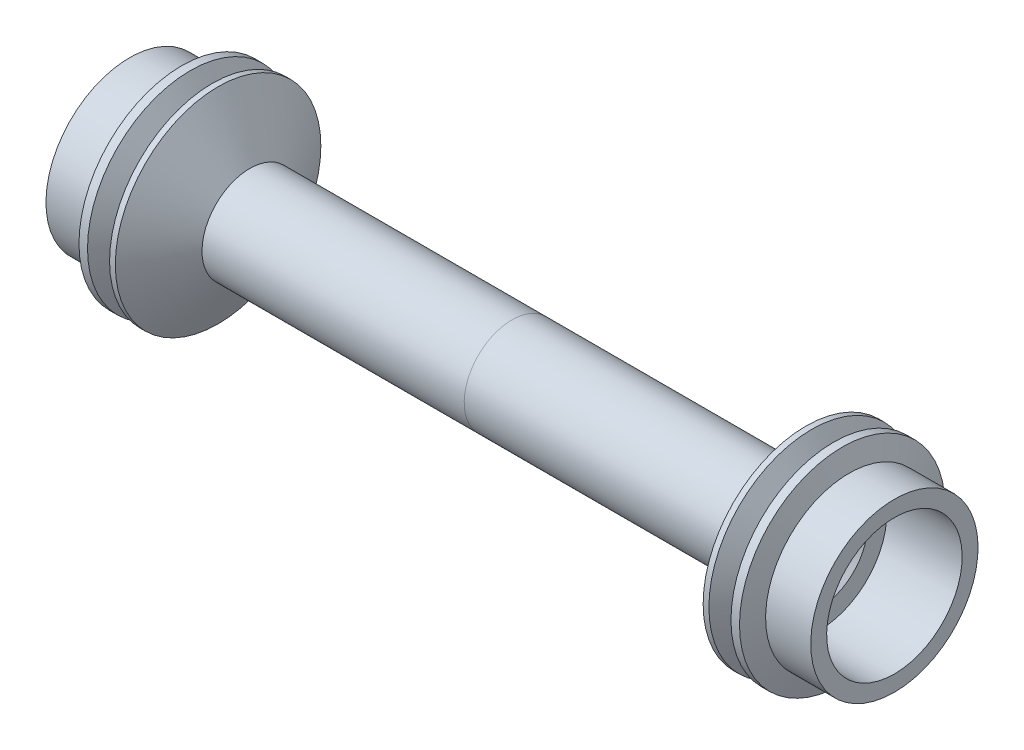
ISO-10303-21;
HEADER;
FILE_DESCRIPTION(('STEP AP214'),'2;1');
FILE_NAME('part.step','',(''),(''),'','','');
FILE_SCHEMA(('AUTOMOTIVE_DESIGN { 1 0 10303 214 1 1 1 1 }'));
ENDSEC;
DATA;
#1=APPLICATION_CONTEXT('core data for automotive mechanical design processes');
#2=APPLICATION_PROTOCOL_DEFINITION('international standard','automotive_design',2000,#1);
#3=PRODUCT_CONTEXT('',#1,'mechanical');
#4=PRODUCT('Part','Part','',(#3));
#5=PRODUCT_RELATED_PRODUCT_CATEGORY('part','',(#4));
#6=PRODUCT_DEFINITION_FORMATION('','',#4);
#7=PRODUCT_DEFINITION_CONTEXT('part definition',#1,'design');
#8=PRODUCT_DEFINITION('design','',#6,#7);
#9=PRODUCT_DEFINITION_SHAPE('','',#8);
#10=(LENGTH_UNIT() NAMED_UNIT(*) SI_UNIT(.MILLI.,.METRE.));
#11=(NAMED_UNIT(*) PLANE_ANGLE_UNIT() SI_UNIT($,.RADIAN.));
#12=(NAMED_UNIT(*) SI_UNIT($,.STERADIAN.) SOLID_ANGLE_UNIT());
#13=UNCERTAINTY_MEASURE_WITH_UNIT(LENGTH_MEASURE(1.E-05),#10,'distance_accuracy_value','');
#14=(GEOMETRIC_REPRESENTATION_CONTEXT(3) GLOBAL_UNCERTAINTY_ASSIGNED_CONTEXT((#13)) GLOBAL_UNIT_ASSIGNED_CONTEXT((#10,
#11,#12)) REPRESENTATION_CONTEXT('',''));
#15=CARTESIAN_POINT('',(0.,0.,0.));
#16=DIRECTION('',(0.,0.,1.));
#17=DIRECTION('',(1.,0.,0.));
#18=AXIS2_PLACEMENT_3D('',#15,#16,#17);
#19=CARTESIAN_POINT('',(20.4,0.,0.));
#20=DIRECTION('',(1.,0.,0.));
#21=DIRECTION('',(0.,-1.,0.));
#22=AXIS2_PLACEMENT_3D('',#19,#20,#21);
#23=CONICAL_SURFACE('',#22,3.23,0.785398163397443);
#24=CARTESIAN_POINT('',(19.892,0.,0.));
#25=DIRECTION('',(-1.,0.,0.));
#26=DIRECTION('',(0.,-1.,0.));
#27=AXIS2_PLACEMENT_3D('',#24,#25,#26);
#28=CIRCLE('',#27,2.722);
#29=CARTESIAN_POINT('',(19.892,-2.722,0.));
#30=VERTEX_POINT('',#29);
#31=EDGE_CURVE('E12',#30,#30,#28,.T.);
#32=ORIENTED_EDGE('',*,*,#31,.T.);
#33=EDGE_LOOP('',(#32));
#34=FACE_BOUND('',#33,.T.);
#35=CARTESIAN_POINT('',(20.4,0.,0.));
#36=DIRECTION('',(-1.,0.,0.));
#37=DIRECTION('',(0.,-1.,0.));
#38=AXIS2_PLACEMENT_3D('',#35,#36,#37);
#39=CIRCLE('',#38,3.23);
#40=CARTESIAN_POINT('',(20.4,-3.23,0.));
#41=VERTEX_POINT('',#40);
#42=EDGE_CURVE('E116',#41,#41,#39,.T.);
#43=ORIENTED_EDGE('',*,*,#42,.F.);
#44=EDGE_LOOP('',(#43));
#45=FACE_BOUND('',#44,.T.);
#46=ADVANCED_FACE('F59',(#34,#45),#23,.F.);
#47=CARTESIAN_POINT('',(19.892,0.,0.));
#48=DIRECTION('',(-1.,0.,0.));
#49=DIRECTION('',(0.,1.,0.));
#50=AXIS2_PLACEMENT_3D('',#47,#48,#49);
#51=PLANE('',#50);
#52=CARTESIAN_POINT('',(19.892,0.,0.));
#53=DIRECTION('',(-1.,0.,0.));
#54=DIRECTION('',(0.,-1.,0.));
#55=AXIS2_PLACEMENT_3D('',#52,#53,#54);
#56=CIRCLE('',#55,1.7145);
#57=CARTESIAN_POINT('',(19.892,-1.7145,0.));
#58=VERTEX_POINT('',#57);
#59=EDGE_CURVE('E66',#58,#58,#56,.T.);
#60=ORIENTED_EDGE('',*,*,#59,.T.);
#61=EDGE_LOOP('',(#60));
#62=FACE_BOUND('',#61,.T.);
#63=ORIENTED_EDGE('',*,*,#31,.F.);
#64=EDGE_LOOP('',(#63));
#65=FACE_BOUND('',#64,.T.);
#66=ADVANCED_FACE('F95',(#62,#65),#51,.F.);
#67=CARTESIAN_POINT('',(25.4,0.,0.));
#68=DIRECTION('',(1.,0.,0.));
#69=DIRECTION('',(0.,-1.,0.));
#70=AXIS2_PLACEMENT_3D('',#67,#68,#69);
#71=CYLINDRICAL_SURFACE('',#70,1.7145);
#72=CARTESIAN_POINT('',(15.575,0.,0.));
#73=DIRECTION('',(-1.,0.,0.));
#74=DIRECTION('',(0.,-1.,0.));
#75=AXIS2_PLACEMENT_3D('',#72,#73,#74);
#76=CIRCLE('',#75,1.7145);
#77=CARTESIAN_POINT('',(15.575,-1.7145,0.));
#78=VERTEX_POINT('',#77);
#79=EDGE_CURVE('E80',#78,#78,#76,.T.);
#80=ORIENTED_EDGE('',*,*,#79,.T.);
#81=EDGE_LOOP('',(#80));
#82=FACE_BOUND('',#81,.T.);
#83=ORIENTED_EDGE('',*,*,#59,.F.);
#84=EDGE_LOOP('',(#83));
#85=FACE_BOUND('',#84,.T.);
#86=ADVANCED_FACE('F98',(#82,#85),#71,.F.);
#87=CARTESIAN_POINT('',(15.575,0.,0.));
#88=DIRECTION('',(-1.,0.,0.));
#89=DIRECTION('',(0.,1.,0.));
#90=AXIS2_PLACEMENT_3D('',#87,#88,#89);
#91=PLANE('',#90);
#92=ORIENTED_EDGE('',*,*,#79,.F.);
#93=EDGE_LOOP('',(#92));
#94=FACE_BOUND('',#93,.T.);
#95=ADVANCED_FACE('F73',(#94),#91,.F.);
#96=CARTESIAN_POINT('',(12.5,0.,0.));
#97=DIRECTION('',(-1.,0.,0.));
#98=DIRECTION('',(0.,1.,0.));
#99=AXIS2_PLACEMENT_3D('',#96,#97,#98);
#100=CONICAL_SURFACE('',#99,1.6,0.78539816339745);
#101=CARTESIAN_POINT('',(14.1,0.,0.));
#102=VERTEX_POINT('',#101);
#103=VERTEX_LOOP('',#102);
#104=FACE_BOUND('',#103,.T.);
#105=CARTESIAN_POINT('',(12.5,0.,0.));
#106=DIRECTION('',(-1.,0.,0.));
#107=DIRECTION('',(0.,-1.,0.));
#108=AXIS2_PLACEMENT_3D('',#105,#106,#107);
#109=CIRCLE('',#108,1.6);
#110=CARTESIAN_POINT('',(12.5,-1.6,0.));
#111=VERTEX_POINT('',#110);
#112=EDGE_CURVE('E77',#111,#111,#109,.T.);
#113=ORIENTED_EDGE('',*,*,#112,.T.);
#114=EDGE_LOOP('',(#113));
#115=FACE_BOUND('',#114,.T.);
#116=ADVANCED_FACE('F69',(#104,#115),#100,.F.);
#117=CARTESIAN_POINT('',(25.4,0.,0.));
#118=DIRECTION('',(1.,0.,0.));
#119=DIRECTION('',(0.,-1.,0.));
#120=AXIS2_PLACEMENT_3D('',#117,#118,#119);
#121=CYLINDRICAL_SURFACE('',#120,1.6);
#122=ORIENTED_EDGE('',*,*,#112,.F.);
#123=EDGE_LOOP('',(#122));
#124=FACE_BOUND('',#123,.T.);
#125=CARTESIAN_POINT('',(0.,0.,0.));
#126=DIRECTION('',(-1.,0.,0.));
#127=DIRECTION('',(0.,-1.,0.));
#128=AXIS2_PLACEMENT_3D('',#125,#126,#127);
#129=CIRCLE('',#128,1.6);
#130=CARTESIAN_POINT('',(0.,-1.6,0.));
#131=VERTEX_POINT('',#130);
#132=EDGE_CURVE('E81',#131,#131,#129,.T.);
#133=ORIENTED_EDGE('',*,*,#132,.T.);
#134=EDGE_LOOP('',(#133));
#135=FACE_BOUND('',#134,.T.);
#136=ADVANCED_FACE('F72',(#124,#135),#121,.F.);
#137=CARTESIAN_POINT('',(0.,0.,0.));
#138=DIRECTION('',(1.,0.,0.));
#139=DIRECTION('',(0.,-1.,0.));
#140=AXIS2_PLACEMENT_3D('',#137,#138,#139);
#141=PLANE('',#140);
#142=CARTESIAN_POINT('',(0.,0.,0.));
#143=DIRECTION('',(-1.,0.,0.));
#144=DIRECTION('',(0.,-1.,0.));
#145=AXIS2_PLACEMENT_3D('',#142,#143,#144);
#146=CIRCLE('',#145,3.175);
#147=CARTESIAN_POINT('',(0.,-3.175,0.));
#148=VERTEX_POINT('',#147);
#149=EDGE_CURVE('E88',#148,#148,#146,.T.);
#150=ORIENTED_EDGE('',*,*,#149,.T.);
#151=EDGE_LOOP('',(#150));
#152=FACE_BOUND('',#151,.T.);
#153=ORIENTED_EDGE('',*,*,#132,.F.);
#154=EDGE_LOOP('',(#153));
#155=FACE_BOUND('',#154,.T.);
#156=ADVANCED_FACE('F164',(#152,#155),#141,.F.);
#157=CARTESIAN_POINT('',(25.4,0.,0.));
#158=DIRECTION('',(1.,0.,0.));
#159=DIRECTION('',(0.,-1.,0.));
#160=AXIS2_PLACEMENT_3D('',#157,#158,#159);
#161=CYLINDRICAL_SURFACE('',#160,3.175);
#162=ORIENTED_EDGE('',*,*,#149,.F.);
#163=EDGE_LOOP('',(#162));
#164=FACE_BOUND('',#163,.T.);
#165=CARTESIAN_POINT('',(17.4152149877506,0.,0.));
#166=DIRECTION('',(-1.,0.,0.));
#167=DIRECTION('',(0.,-1.,0.));
#168=AXIS2_PLACEMENT_3D('',#165,#166,#167);
#169=CIRCLE('',#168,3.175);
#170=CARTESIAN_POINT('',(17.4152149877506,-3.175,0.));
#171=VERTEX_POINT('',#170);
#172=EDGE_CURVE('E157',#171,#171,#169,.T.);
#173=ORIENTED_EDGE('',*,*,#172,.T.);
#174=EDGE_LOOP('',(#173));
#175=FACE_BOUND('',#174,.T.);
#176=ADVANCED_FACE('F167',(#164,#175),#161,.T.);
#177=CARTESIAN_POINT('',(19.5232651581292,0.,0.));
#178=DIRECTION('',(1.,0.,0.));
#179=DIRECTION('',(0.,-1.,0.));
#180=AXIS2_PLACEMENT_3D('',#177,#178,#179);
#181=CONICAL_SURFACE('',#180,6.82625,1.0471975511966);
#182=ORIENTED_EDGE('',*,*,#172,.F.);
#183=EDGE_LOOP('',(#182));
#184=FACE_BOUND('',#183,.T.);
#185=CARTESIAN_POINT('',(19.5232651581292,0.,0.));
#186=DIRECTION('',(-1.,0.,0.));
#187=DIRECTION('',(0.,-1.,0.));
#188=AXIS2_PLACEMENT_3D('',#185,#186,#187);
#189=CIRCLE('',#188,6.82625);
#190=CARTESIAN_POINT('',(19.5232651581292,-6.82625,0.));
#191=VERTEX_POINT('',#190);
#192=EDGE_CURVE('E153',#191,#191,#189,.T.);
#193=ORIENTED_EDGE('',*,*,#192,.T.);
#194=EDGE_LOOP('',(#193));
#195=FACE_BOUND('',#194,.T.);
#196=ADVANCED_FACE('F170',(#184,#195),#181,.T.);
#197=CARTESIAN_POINT('',(25.4,0.,0.));
#198=DIRECTION('',(1.,0.,0.));
#199=DIRECTION('',(0.,-1.,0.));
#200=AXIS2_PLACEMENT_3D('',#197,#198,#199);
#201=CYLINDRICAL_SURFACE('',#200,6.82625);
#202=ORIENTED_EDGE('',*,*,#192,.F.);
#203=EDGE_LOOP('',(#202));
#204=FACE_BOUND('',#203,.T.);
#205=CARTESIAN_POINT('',(19.9042651581292,0.,0.));
#206=DIRECTION('',(-1.,0.,0.));
#207=DIRECTION('',(0.,-1.,0.));
#208=AXIS2_PLACEMENT_3D('',#205,#206,#207);
#209=CIRCLE('',#208,6.82625);
#210=CARTESIAN_POINT('',(19.9042651581292,-6.82625,0.));
#211=VERTEX_POINT('',#210);
#212=EDGE_CURVE('E149',#211,#211,#209,.T.);
#213=ORIENTED_EDGE('',*,*,#212,.T.);
#214=EDGE_LOOP('',(#213));
#215=FACE_BOUND('',#214,.T.);
#216=ADVANCED_FACE('F176',(#204,#215),#201,.T.);
#217=CARTESIAN_POINT('',(20.6375,0.,0.));
#218=DIRECTION('',(-1.,0.,0.));
#219=DIRECTION('',(0.,1.,0.));
#220=AXIS2_PLACEMENT_3D('',#217,#218,#219);
#221=CONICAL_SURFACE('',#220,5.55625,1.0471975511966);
#222=ORIENTED_EDGE('',*,*,#212,.F.);
#223=EDGE_LOOP('',(#222));
#224=FACE_BOUND('',#223,.T.);
#225=CARTESIAN_POINT('',(20.6375,0.,0.));
#226=DIRECTION('',(-1.,0.,0.));
#227=DIRECTION('',(0.,-1.,0.));
#228=AXIS2_PLACEMENT_3D('',#225,#226,#227);
#229=CIRCLE('',#228,5.55625);
#230=CARTESIAN_POINT('',(20.6375,-5.55625,0.));
#231=VERTEX_POINT('',#230);
#232=EDGE_CURVE('E145',#231,#231,#229,.T.);
#233=ORIENTED_EDGE('',*,*,#232,.T.);
#234=EDGE_LOOP('',(#233));
#235=FACE_BOUND('',#234,.T.);
#236=ADVANCED_FACE('F182',(#224,#235),#221,.T.);
#237=CARTESIAN_POINT('',(21.3707348418708,0.,0.));
#238=DIRECTION('',(1.,0.,0.));
#239=DIRECTION('',(0.,-1.,0.));
#240=AXIS2_PLACEMENT_3D('',#237,#238,#239);
#241=CONICAL_SURFACE('',#240,6.82625,1.0471975511966);
#242=ORIENTED_EDGE('',*,*,#232,.F.);
#243=EDGE_LOOP('',(#242));
#244=FACE_BOUND('',#243,.T.);
#245=CARTESIAN_POINT('',(21.3707348418708,0.,0.));
#246=DIRECTION('',(-1.,0.,0.));
#247=DIRECTION('',(0.,-1.,0.));
#248=AXIS2_PLACEMENT_3D('',#245,#246,#247);
#249=CIRCLE('',#248,6.82625);
#250=CARTESIAN_POINT('',(21.3707348418708,-6.82625,0.));
#251=VERTEX_POINT('',#250);
#252=EDGE_CURVE('E141',#251,#251,#249,.T.);
#253=ORIENTED_EDGE('',*,*,#252,.T.);
#254=EDGE_LOOP('',(#253));
#255=FACE_BOUND('',#254,.T.);
#256=ADVANCED_FACE('F188',(#244,#255),#241,.T.);
#257=CARTESIAN_POINT('',(25.4,0.,0.));
#258=DIRECTION('',(1.,0.,0.));
#259=DIRECTION('',(0.,-1.,0.));
#260=AXIS2_PLACEMENT_3D('',#257,#258,#259);
#261=CYLINDRICAL_SURFACE('',#260,6.82625);
#262=ORIENTED_EDGE('',*,*,#252,.F.);
#263=EDGE_LOOP('',(#262));
#264=FACE_BOUND('',#263,.T.);
#265=CARTESIAN_POINT('',(21.9377578024819,0.,0.));
#266=DIRECTION('',(-1.,0.,0.));
#267=DIRECTION('',(0.,-1.,0.));
#268=AXIS2_PLACEMENT_3D('',#265,#266,#267);
#269=CIRCLE('',#268,6.82625);
#270=CARTESIAN_POINT('',(21.9377578024819,-6.82625,0.));
#271=VERTEX_POINT('',#270);
#272=EDGE_CURVE('E137',#271,#271,#269,.T.);
#273=ORIENTED_EDGE('',*,*,#272,.T.);
#274=EDGE_LOOP('',(#273));
#275=FACE_BOUND('',#274,.T.);
#276=ADVANCED_FACE('F194',(#264,#275),#261,.T.);
#277=CARTESIAN_POINT('',(22.4,0.,0.));
#278=DIRECTION('',(-1.,0.,0.));
#279=DIRECTION('',(0.,1.,0.));
#280=AXIS2_PLACEMENT_3D('',#277,#278,#279);
#281=CONICAL_SURFACE('',#280,5.55625,1.22173047639603);
#282=ORIENTED_EDGE('',*,*,#272,.F.);
#283=EDGE_LOOP('',(#282));
#284=FACE_BOUND('',#283,.T.);
#285=CARTESIAN_POINT('',(22.4,0.,0.));
#286=DIRECTION('',(-1.,0.,0.));
#287=DIRECTION('',(0.,-1.,0.));
#288=AXIS2_PLACEMENT_3D('',#285,#286,#287);
#289=CIRCLE('',#288,5.55625);
#290=CARTESIAN_POINT('',(22.4,-5.55625,0.));
#291=VERTEX_POINT('',#290);
#292=EDGE_CURVE('E133',#291,#291,#289,.T.);
#293=ORIENTED_EDGE('',*,*,#292,.T.);
#294=EDGE_LOOP('',(#293));
#295=FACE_BOUND('',#294,.T.);
#296=ADVANCED_FACE('F200',(#284,#295),#281,.T.);
#297=CARTESIAN_POINT('',(25.4,0.,0.));
#298=DIRECTION('',(1.,0.,0.));
#299=DIRECTION('',(0.,-1.,0.));
#300=AXIS2_PLACEMENT_3D('',#297,#298,#299);
#301=CYLINDRICAL_SURFACE('',#300,5.55625);
#302=ORIENTED_EDGE('',*,*,#292,.F.);
#303=EDGE_LOOP('',(#302));
#304=FACE_BOUND('',#303,.T.);
#305=CARTESIAN_POINT('',(25.4,0.,0.));
#306=DIRECTION('',(-1.,0.,0.));
#307=DIRECTION('',(0.,-1.,0.));
#308=AXIS2_PLACEMENT_3D('',#305,#306,#307);
#309=CIRCLE('',#308,5.55625);
#310=CARTESIAN_POINT('',(25.4,-5.55625,0.));
#311=VERTEX_POINT('',#310);
#312=EDGE_CURVE('E129',#311,#311,#309,.T.);
#313=ORIENTED_EDGE('',*,*,#312,.T.);
#314=EDGE_LOOP('',(#313));
#315=FACE_BOUND('',#314,.T.);
#316=ADVANCED_FACE('F206',(#304,#315),#301,.T.);
#317=CARTESIAN_POINT('',(25.4,0.,0.));
#318=DIRECTION('',(-1.,0.,0.));
#319=DIRECTION('',(0.,1.,0.));
#320=AXIS2_PLACEMENT_3D('',#317,#318,#319);
#321=PLANE('',#320);
#322=CARTESIAN_POINT('',(25.4,0.,0.));
#323=DIRECTION('',(-1.,0.,0.));
#324=DIRECTION('',(0.,-1.,0.));
#325=AXIS2_PLACEMENT_3D('',#322,#323,#324);
#326=CIRCLE('',#325,4.5);
#327=CARTESIAN_POINT('',(25.4,-4.5,0.));
#328=VERTEX_POINT('',#327);
#329=EDGE_CURVE('E123',#328,#328,#326,.T.);
#330=ORIENTED_EDGE('',*,*,#329,.T.);
#331=EDGE_LOOP('',(#330));
#332=FACE_BOUND('',#331,.T.);
#333=ORIENTED_EDGE('',*,*,#312,.F.);
#334=EDGE_LOOP('',(#333));
#335=FACE_BOUND('',#334,.T.);
#336=ADVANCED_FACE('F212',(#332,#335),#321,.F.);
#337=CARTESIAN_POINT('',(25.4,0.,0.));
#338=DIRECTION('',(1.,0.,0.));
#339=DIRECTION('',(0.,-1.,0.));
#340=AXIS2_PLACEMENT_3D('',#337,#338,#339);
#341=CYLINDRICAL_SURFACE('',#340,4.5);
#342=CARTESIAN_POINT('',(20.4,0.,0.));
#343=DIRECTION('',(-1.,0.,0.));
#344=DIRECTION('',(0.,-1.,0.));
#345=AXIS2_PLACEMENT_3D('',#342,#343,#344);
#346=CIRCLE('',#345,4.5);
#347=CARTESIAN_POINT('',(20.4,-4.5,0.));
#348=VERTEX_POINT('',#347);
#349=EDGE_CURVE('E119',#348,#348,#346,.T.);
#350=ORIENTED_EDGE('',*,*,#349,.T.);
#351=EDGE_LOOP('',(#350));
#352=FACE_BOUND('',#351,.T.);
#353=ORIENTED_EDGE('',*,*,#329,.F.);
#354=EDGE_LOOP('',(#353));
#355=FACE_BOUND('',#354,.T.);
#356=ADVANCED_FACE('F217',(#352,#355),#341,.F.);
#357=CARTESIAN_POINT('',(20.4,0.,0.));
#358=DIRECTION('',(-1.,0.,0.));
#359=DIRECTION('',(0.,1.,0.));
#360=AXIS2_PLACEMENT_3D('',#357,#358,#359);
#361=PLANE('',#360);
#362=ORIENTED_EDGE('',*,*,#42,.T.);
#363=EDGE_LOOP('',(#362));
#364=FACE_BOUND('',#363,.T.);
#365=ORIENTED_EDGE('',*,*,#349,.F.);
#366=EDGE_LOOP('',(#365));
#367=FACE_BOUND('',#366,.T.);
#368=ADVANCED_FACE('F223',(#364,#367),#361,.F.);
#369=CLOSED_SHELL('',(#46,#66,#86,#95,#116,#136,#156,#176,#196,#216,#236,#256,#276,#296,#316,
#336,#356,#368));
#370=MANIFOLD_SOLID_BREP('B2',#369);
#371=CARTESIAN_POINT('',(-20.4,0.,0.));
#372=DIRECTION('',(-1.,0.,0.));
#373=DIRECTION('',(0.,-1.,0.));
#374=AXIS2_PLACEMENT_3D('',#371,#372,#373);
#375=CONICAL_SURFACE('',#374,3.23,0.785398163397443);
#376=CARTESIAN_POINT('',(-19.892,0.,0.));
#377=DIRECTION('',(-1.,0.,0.));
#378=DIRECTION('',(0.,-1.,0.));
#379=AXIS2_PLACEMENT_3D('',#376,#377,#378);
#380=CIRCLE('',#379,2.722);
#381=CARTESIAN_POINT('',(-19.892,-2.722,0.));
#382=VERTEX_POINT('',#381);
#383=EDGE_CURVE('E378',#382,#382,#380,.T.);
#384=ORIENTED_EDGE('',*,*,#383,.F.);
#385=EDGE_LOOP('',(#384));
#386=FACE_BOUND('',#385,.T.);
#387=CARTESIAN_POINT('',(-20.4,0.,0.));
#388=DIRECTION('',(-1.,0.,0.));
#389=DIRECTION('',(0.,-1.,0.));
#390=AXIS2_PLACEMENT_3D('',#387,#388,#389);
#391=CIRCLE('',#390,3.23);
#392=CARTESIAN_POINT('',(-20.4,-3.23,0.));
#393=VERTEX_POINT('',#392);
#394=EDGE_CURVE('E578',#393,#393,#391,.T.);
#395=ORIENTED_EDGE('',*,*,#394,.T.);
#396=EDGE_LOOP('',(#395));
#397=FACE_BOUND('',#396,.T.);
#398=ADVANCED_FACE('F344',(#386,#397),#375,.F.);
#399=CARTESIAN_POINT('',(-19.892,0.,0.));
#400=DIRECTION('',(1.,0.,0.));
#401=DIRECTION('',(0.,1.,0.));
#402=AXIS2_PLACEMENT_3D('',#399,#400,#401);
#403=PLANE('',#402);
#404=CARTESIAN_POINT('',(-19.892,0.,0.));
#405=DIRECTION('',(-1.,0.,0.));
#406=DIRECTION('',(0.,-1.,0.));
#407=AXIS2_PLACEMENT_3D('',#404,#405,#406);
#408=CIRCLE('',#407,1.7145);
#409=CARTESIAN_POINT('',(-19.892,-1.7145,0.));
#410=VERTEX_POINT('',#409);
#411=EDGE_CURVE('E369',#410,#410,#408,.T.);
#412=ORIENTED_EDGE('',*,*,#411,.F.);
#413=EDGE_LOOP('',(#412));
#414=FACE_BOUND('',#413,.T.);
#415=ORIENTED_EDGE('',*,*,#383,.T.);
#416=EDGE_LOOP('',(#415));
#417=FACE_BOUND('',#416,.T.);
#418=ADVANCED_FACE('F397',(#414,#417),#403,.F.);
#419=CARTESIAN_POINT('',(-25.4,0.,0.));
#420=DIRECTION('',(-1.,0.,0.));
#421=DIRECTION('',(0.,-1.,0.));
#422=AXIS2_PLACEMENT_3D('',#419,#420,#421);
#423=CYLINDRICAL_SURFACE('',#422,1.7145);
#424=CARTESIAN_POINT('',(-15.575,0.,0.));
#425=DIRECTION('',(-1.,0.,0.));
#426=DIRECTION('',(0.,-1.,0.));
#427=AXIS2_PLACEMENT_3D('',#424,#425,#426);
#428=CIRCLE('',#427,1.7145);
#429=CARTESIAN_POINT('',(-15.575,-1.7145,0.));
#430=VERTEX_POINT('',#429);
#431=EDGE_CURVE('E365',#430,#430,#428,.T.);
#432=ORIENTED_EDGE('',*,*,#431,.F.);
#433=EDGE_LOOP('',(#432));
#434=FACE_BOUND('',#433,.T.);
#435=ORIENTED_EDGE('',*,*,#411,.T.);
#436=EDGE_LOOP('',(#435));
#437=FACE_BOUND('',#436,.T.);
#438=ADVANCED_FACE('F402',(#434,#437),#423,.F.);
#439=CARTESIAN_POINT('',(-15.575,0.,0.));
#440=DIRECTION('',(1.,0.,0.));
#441=DIRECTION('',(0.,1.,0.));
#442=AXIS2_PLACEMENT_3D('',#439,#440,#441);
#443=PLANE('',#442);
#444=ORIENTED_EDGE('',*,*,#431,.T.);
#445=EDGE_LOOP('',(#444));
#446=FACE_BOUND('',#445,.T.);
#447=ADVANCED_FACE('F359',(#446),#443,.F.);
#448=CARTESIAN_POINT('',(-12.5,0.,0.));
#449=DIRECTION('',(1.,0.,0.));
#450=DIRECTION('',(0.,1.,0.));
#451=AXIS2_PLACEMENT_3D('',#448,#449,#450);
#452=CONICAL_SURFACE('',#451,1.6,0.78539816339745);
#453=CARTESIAN_POINT('',(-14.1,0.,0.));
#454=VERTEX_POINT('',#453);
#455=VERTEX_LOOP('',#454);
#456=FACE_BOUND('',#455,.T.);
#457=CARTESIAN_POINT('',(-12.5,0.,0.));
#458=DIRECTION('',(-1.,0.,0.));
#459=DIRECTION('',(0.,-1.,0.));
#460=AXIS2_PLACEMENT_3D('',#457,#458,#459);
#461=CIRCLE('',#460,1.6);
#462=CARTESIAN_POINT('',(-12.5,-1.6,0.));
#463=VERTEX_POINT('',#462);
#464=EDGE_CURVE('E363',#463,#463,#461,.T.);
#465=ORIENTED_EDGE('',*,*,#464,.F.);
#466=EDGE_LOOP('',(#465));
#467=FACE_BOUND('',#466,.T.);
#468=ADVANCED_FACE('F355',(#456,#467),#452,.F.);
#469=CARTESIAN_POINT('',(-25.4,0.,0.));
#470=DIRECTION('',(-1.,0.,0.));
#471=DIRECTION('',(0.,-1.,0.));
#472=AXIS2_PLACEMENT_3D('',#469,#470,#471);
#473=CYLINDRICAL_SURFACE('',#472,1.6);
#474=ORIENTED_EDGE('',*,*,#464,.T.);
#475=EDGE_LOOP('',(#474));
#476=FACE_BOUND('',#475,.T.);
#477=CARTESIAN_POINT('',(0.,0.,0.));
#478=DIRECTION('',(-1.,0.,0.));
#479=DIRECTION('',(0.,-1.,0.));
#480=AXIS2_PLACEMENT_3D('',#477,#478,#479);
#481=CIRCLE('',#480,1.6);
#482=CARTESIAN_POINT('',(0.,-1.6,0.));
#483=VERTEX_POINT('',#482);
#484=EDGE_CURVE('E366',#483,#483,#481,.T.);
#485=ORIENTED_EDGE('',*,*,#484,.F.);
#486=EDGE_LOOP('',(#485));
#487=FACE_BOUND('',#486,.T.);
#488=ADVANCED_FACE('F358',(#476,#487),#473,.F.);
#489=CARTESIAN_POINT('',(0.,0.,0.));
#490=DIRECTION('',(-1.,0.,0.));
#491=DIRECTION('',(0.,-1.,0.));
#492=AXIS2_PLACEMENT_3D('',#489,#490,#491);
#493=PLANE('',#492);
#494=CARTESIAN_POINT('',(0.,0.,0.));
#495=DIRECTION('',(-1.,0.,0.));
#496=DIRECTION('',(0.,-1.,0.));
#497=AXIS2_PLACEMENT_3D('',#494,#495,#496);
#498=CIRCLE('',#497,3.175);
#499=CARTESIAN_POINT('',(0.,-3.175,0.));
#500=VERTEX_POINT('',#499);
#501=EDGE_CURVE('E372',#500,#500,#498,.T.);
#502=ORIENTED_EDGE('',*,*,#501,.F.);
#503=EDGE_LOOP('',(#502));
#504=FACE_BOUND('',#503,.T.);
#505=ORIENTED_EDGE('',*,*,#484,.T.);
#506=EDGE_LOOP('',(#505));
#507=FACE_BOUND('',#506,.T.);
#508=ADVANCED_FACE('F416',(#504,#507),#493,.F.);
#509=CARTESIAN_POINT('',(-25.4,0.,0.));
#510=DIRECTION('',(-1.,0.,0.));
#511=DIRECTION('',(0.,-1.,0.));
#512=AXIS2_PLACEMENT_3D('',#509,#510,#511);
#513=CYLINDRICAL_SURFACE('',#512,3.175);
#514=ORIENTED_EDGE('',*,*,#501,.T.);
#515=EDGE_LOOP('',(#514));
#516=FACE_BOUND('',#515,.T.);
#517=CARTESIAN_POINT('',(-17.4152149877506,0.,0.));
#518=DIRECTION('',(-1.,0.,0.));
#519=DIRECTION('',(0.,-1.,0.));
#520=AXIS2_PLACEMENT_3D('',#517,#518,#519);
#521=CIRCLE('',#520,3.175);
#522=CARTESIAN_POINT('',(-17.4152149877506,-3.175,0.));
#523=VERTEX_POINT('',#522);
#524=EDGE_CURVE('E596',#523,#523,#521,.T.);
#525=ORIENTED_EDGE('',*,*,#524,.F.);
#526=EDGE_LOOP('',(#525));
#527=FACE_BOUND('',#526,.T.);
#528=ADVANCED_FACE('F419',(#516,#527),#513,.T.);
#529=CARTESIAN_POINT('',(-19.5232651581292,0.,0.));
#530=DIRECTION('',(-1.,0.,0.));
#531=DIRECTION('',(0.,-1.,0.));
#532=AXIS2_PLACEMENT_3D('',#529,#530,#531);
#533=CONICAL_SURFACE('',#532,6.82625,1.0471975511966);
#534=ORIENTED_EDGE('',*,*,#524,.T.);
#535=EDGE_LOOP('',(#534));
#536=FACE_BOUND('',#535,.T.);
#537=CARTESIAN_POINT('',(-19.5232651581292,0.,0.));
#538=DIRECTION('',(-1.,0.,0.));
#539=DIRECTION('',(0.,-1.,0.));
#540=AXIS2_PLACEMENT_3D('',#537,#538,#539);
#541=CIRCLE('',#540,6.82625);
#542=CARTESIAN_POINT('',(-19.5232651581292,-6.82625,0.));
#543=VERTEX_POINT('',#542);
#544=EDGE_CURVE('E593',#543,#543,#541,.T.);
#545=ORIENTED_EDGE('',*,*,#544,.F.);
#546=EDGE_LOOP('',(#545));
#547=FACE_BOUND('',#546,.T.);
#548=ADVANCED_FACE('F423',(#536,#547),#533,.T.);
#549=CARTESIAN_POINT('',(-25.4,0.,0.));
#550=DIRECTION('',(-1.,0.,0.));
#551=DIRECTION('',(0.,-1.,0.));
#552=AXIS2_PLACEMENT_3D('',#549,#550,#551);
#553=CYLINDRICAL_SURFACE('',#552,6.82625);
#554=ORIENTED_EDGE('',*,*,#544,.T.);
#555=EDGE_LOOP('',(#554));
#556=FACE_BOUND('',#555,.T.);
#557=CARTESIAN_POINT('',(-19.9042651581292,0.,0.));
#558=DIRECTION('',(-1.,0.,0.));
#559=DIRECTION('',(0.,-1.,0.));
#560=AXIS2_PLACEMENT_3D('',#557,#558,#559);
#561=CIRCLE('',#560,6.82625);
#562=CARTESIAN_POINT('',(-19.9042651581292,-6.82625,0.));
#563=VERTEX_POINT('',#562);
#564=EDGE_CURVE('E590',#563,#563,#561,.T.);
#565=ORIENTED_EDGE('',*,*,#564,.F.);
#566=EDGE_LOOP('',(#565));
#567=FACE_BOUND('',#566,.T.);
#568=ADVANCED_FACE('F427',(#556,#567),#553,.T.);
#569=CARTESIAN_POINT('',(-20.6375,0.,0.));
#570=DIRECTION('',(1.,0.,0.));
#571=DIRECTION('',(0.,1.,0.));
#572=AXIS2_PLACEMENT_3D('',#569,#570,#571);
#573=CONICAL_SURFACE('',#572,5.55625,1.0471975511966);
#574=ORIENTED_EDGE('',*,*,#564,.T.);
#575=EDGE_LOOP('',(#574));
#576=FACE_BOUND('',#575,.T.);
#577=CARTESIAN_POINT('',(-20.6375,0.,0.));
#578=DIRECTION('',(-1.,0.,0.));
#579=DIRECTION('',(0.,-1.,0.));
#580=AXIS2_PLACEMENT_3D('',#577,#578,#579);
#581=CIRCLE('',#580,5.55625);
#582=CARTESIAN_POINT('',(-20.6375,-5.55625,0.));
#583=VERTEX_POINT('',#582);
#584=EDGE_CURVE('E587',#583,#583,#581,.T.);
#585=ORIENTED_EDGE('',*,*,#584,.F.);
#586=EDGE_LOOP('',(#585));
#587=FACE_BOUND('',#586,.T.);
#588=ADVANCED_FACE('F431',(#576,#587),#573,.T.);
#589=CARTESIAN_POINT('',(-21.3707348418708,0.,0.));
#590=DIRECTION('',(-1.,0.,0.));
#591=DIRECTION('',(0.,-1.,0.));
#592=AXIS2_PLACEMENT_3D('',#589,#590,#591);
#593=CONICAL_SURFACE('',#592,6.82625,1.0471975511966);
#594=ORIENTED_EDGE('',*,*,#584,.T.);
#595=EDGE_LOOP('',(#594));
#596=FACE_BOUND('',#595,.T.);
#597=CARTESIAN_POINT('',(-21.3707348418708,0.,0.));
#598=DIRECTION('',(-1.,0.,0.));
#599=DIRECTION('',(0.,-1.,0.));
#600=AXIS2_PLACEMENT_3D('',#597,#598,#599);
#601=CIRCLE('',#600,6.82625);
#602=CARTESIAN_POINT('',(-21.3707348418708,-6.82625,0.));
#603=VERTEX_POINT('',#602);
#604=EDGE_CURVE('E584',#603,#603,#601,.T.);
#605=ORIENTED_EDGE('',*,*,#604,.F.);
#606=EDGE_LOOP('',(#605));
#607=FACE_BOUND('',#606,.T.);
#608=ADVANCED_FACE('F435',(#596,#607),#593,.T.);
#609=CARTESIAN_POINT('',(-25.4,0.,0.));
#610=DIRECTION('',(-1.,0.,0.));
#611=DIRECTION('',(0.,-1.,0.));
#612=AXIS2_PLACEMENT_3D('',#609,#610,#611);
#613=CYLINDRICAL_SURFACE('',#612,6.82625);
#614=ORIENTED_EDGE('',*,*,#604,.T.);
#615=EDGE_LOOP('',(#614));
#616=FACE_BOUND('',#615,.T.);
#617=CARTESIAN_POINT('',(-21.9377578024819,0.,0.));
#618=DIRECTION('',(-1.,0.,0.));
#619=DIRECTION('',(0.,-1.,0.));
#620=AXIS2_PLACEMENT_3D('',#617,#618,#619);
#621=CIRCLE('',#620,6.82625);
#622=CARTESIAN_POINT('',(-21.9377578024819,-6.82625,0.));
#623=VERTEX_POINT('',#622);
#624=EDGE_CURVE('E575',#623,#623,#621,.T.);
#625=ORIENTED_EDGE('',*,*,#624,.F.);
#626=EDGE_LOOP('',(#625));
#627=FACE_BOUND('',#626,.T.);
#628=ADVANCED_FACE('F439',(#616,#627),#613,.T.);
#629=CARTESIAN_POINT('',(-22.4,0.,0.));
#630=DIRECTION('',(1.,0.,0.));
#631=DIRECTION('',(0.,1.,0.));
#632=AXIS2_PLACEMENT_3D('',#629,#630,#631);
#633=CONICAL_SURFACE('',#632,5.55625,1.22173047639603);
#634=ORIENTED_EDGE('',*,*,#624,.T.);
#635=EDGE_LOOP('',(#634));
#636=FACE_BOUND('',#635,.T.);
#637=CARTESIAN_POINT('',(-22.4,0.,0.));
#638=DIRECTION('',(-1.,0.,0.));
#639=DIRECTION('',(0.,-1.,0.));
#640=AXIS2_PLACEMENT_3D('',#637,#638,#639);
#641=CIRCLE('',#640,5.55625);
#642=CARTESIAN_POINT('',(-22.4,-5.55625,0.));
#643=VERTEX_POINT('',#642);
#644=EDGE_CURVE('E571',#643,#643,#641,.T.);
#645=ORIENTED_EDGE('',*,*,#644,.F.);
#646=EDGE_LOOP('',(#645));
#647=FACE_BOUND('',#646,.T.);
#648=ADVANCED_FACE('F443',(#636,#647),#633,.T.);
#649=CARTESIAN_POINT('',(-25.4,0.,0.));
#650=DIRECTION('',(-1.,0.,0.));
#651=DIRECTION('',(0.,-1.,0.));
#652=AXIS2_PLACEMENT_3D('',#649,#650,#651);
#653=CYLINDRICAL_SURFACE('',#652,5.55625);
#654=ORIENTED_EDGE('',*,*,#644,.T.);
#655=EDGE_LOOP('',(#654));
#656=FACE_BOUND('',#655,.T.);
#657=CARTESIAN_POINT('',(-25.4,0.,0.));
#658=DIRECTION('',(-1.,0.,0.));
#659=DIRECTION('',(0.,-1.,0.));
#660=AXIS2_PLACEMENT_3D('',#657,#658,#659);
#661=CIRCLE('',#660,5.55625);
#662=CARTESIAN_POINT('',(-25.4,-5.55625,0.));
#663=VERTEX_POINT('',#662);
#664=EDGE_CURVE('E569',#663,#663,#661,.T.);
#665=ORIENTED_EDGE('',*,*,#664,.F.);
#666=EDGE_LOOP('',(#665));
#667=FACE_BOUND('',#666,.T.);
#668=ADVANCED_FACE('F447',(#656,#667),#653,.T.);
#669=CARTESIAN_POINT('',(-25.4,0.,0.));
#670=DIRECTION('',(1.,0.,0.));
#671=DIRECTION('',(0.,1.,0.));
#672=AXIS2_PLACEMENT_3D('',#669,#670,#671);
#673=PLANE('',#672);
#674=CARTESIAN_POINT('',(-25.4,0.,0.));
#675=DIRECTION('',(1.,0.,0.));
#676=DIRECTION('',(0.,1.,0.));
#677=AXIS2_PLACEMENT_3D('',#674,#675,#676);
#678=CIRCLE('',#677,5.00800000000001);
#679=CARTESIAN_POINT('',(-25.4,5.00800000000001,0.));
#680=VERTEX_POINT('',#679);
#681=EDGE_CURVE('E57',#680,#680,#678,.T.);
#682=ORIENTED_EDGE('',*,*,#681,.T.);
#683=EDGE_LOOP('',(#682));
#684=FACE_BOUND('',#683,.T.);
#685=ORIENTED_EDGE('',*,*,#664,.T.);
#686=EDGE_LOOP('',(#685));
#687=FACE_BOUND('',#686,.T.);
#688=ADVANCED_FACE('F451',(#684,#687),#673,.F.);
#689=CARTESIAN_POINT('',(-25.4,0.,0.));
#690=DIRECTION('',(-1.,0.,0.));
#691=DIRECTION('',(0.,-1.,0.));
#692=AXIS2_PLACEMENT_3D('',#689,#690,#691);
#693=CYLINDRICAL_SURFACE('',#692,4.5);
#694=CARTESIAN_POINT('',(-24.892,0.,0.));
#695=DIRECTION('',(1.,0.,0.));
#696=DIRECTION('',(0.,1.,0.));
#697=AXIS2_PLACEMENT_3D('',#694,#695,#696);
#698=CIRCLE('',#697,4.5);
#699=CARTESIAN_POINT('',(-24.892,4.5,0.));
#700=VERTEX_POINT('',#699);
#701=EDGE_CURVE('E352',#700,#700,#698,.F.);
#702=ORIENTED_EDGE('',*,*,#701,.T.);
#703=EDGE_LOOP('',(#702));
#704=FACE_BOUND('',#703,.T.);
#705=CARTESIAN_POINT('',(-20.4,0.,0.));
#706=DIRECTION('',(-1.,0.,0.));
#707=DIRECTION('',(0.,-1.,0.));
#708=AXIS2_PLACEMENT_3D('',#705,#706,#707);
#709=CIRCLE('',#708,4.5);
#710=CARTESIAN_POINT('',(-20.4,-4.5,0.));
#711=VERTEX_POINT('',#710);
#712=EDGE_CURVE('E572',#711,#711,#709,.T.);
#713=ORIENTED_EDGE('',*,*,#712,.F.);
#714=EDGE_LOOP('',(#713));
#715=FACE_BOUND('',#714,.T.);
#716=ADVANCED_FACE('F383',(#704,#715),#693,.F.);
#717=CARTESIAN_POINT('',(-20.4,0.,0.));
#718=DIRECTION('',(1.,0.,0.));
#719=DIRECTION('',(0.,1.,0.));
#720=AXIS2_PLACEMENT_3D('',#717,#718,#719);
#721=PLANE('',#720);
#722=ORIENTED_EDGE('',*,*,#394,.F.);
#723=EDGE_LOOP('',(#722));
#724=FACE_BOUND('',#723,.T.);
#725=ORIENTED_EDGE('',*,*,#712,.T.);
#726=EDGE_LOOP('',(#725));
#727=FACE_BOUND('',#726,.T.);
#728=ADVANCED_FACE('F387',(#724,#727),#721,.F.);
#729=CARTESIAN_POINT('',(-24.892,0.,0.));
#730=DIRECTION('',(-1.,0.,0.));
#731=DIRECTION('',(0.,-1.,0.));
#732=AXIS2_PLACEMENT_3D('',#729,#730,#731);
#733=CONICAL_SURFACE('',#732,4.5,0.785398163397456);
#734=ORIENTED_EDGE('',*,*,#681,.F.);
#735=EDGE_LOOP('',(#734));
#736=FACE_BOUND('',#735,.T.);
#737=ORIENTED_EDGE('',*,*,#701,.F.);
#738=EDGE_LOOP('',(#737));
#739=FACE_BOUND('',#738,.T.);
#740=ADVANCED_FACE('F347',(#736,#739),#733,.F.);
#741=CLOSED_SHELL('',(#398,#418,#438,#447,#468,#488,#508,#528,#548,#568,#588,#608,#628,#648,
#668,#688,#716,#728,#740));
#742=MANIFOLD_SOLID_BREP('B6',#741);
#743=ADVANCED_BREP_SHAPE_REPRESENTATION('',(#18,#370,#742),#14);
#744=SHAPE_DEFINITION_REPRESENTATION(#9,#743);
ENDSEC;
END-ISO-10303-21;
